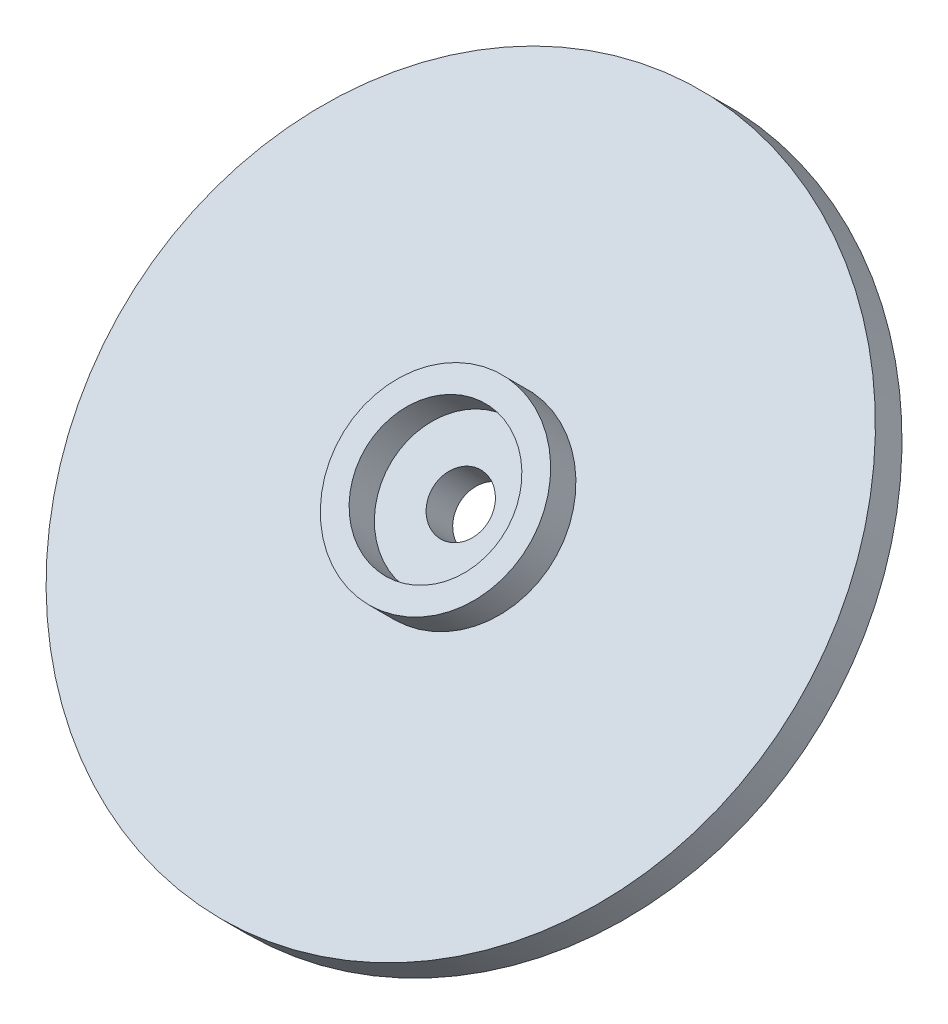
ISO-10303-21;
HEADER;
FILE_DESCRIPTION(('STEP AP214'),'2;1');
FILE_NAME('part.step','',(''),(''),'','','');
FILE_SCHEMA(('AUTOMOTIVE_DESIGN { 1 0 10303 214 1 1 1 1 }'));
ENDSEC;
DATA;
#1=APPLICATION_CONTEXT('core data for automotive mechanical design processes');
#2=APPLICATION_PROTOCOL_DEFINITION('international standard','automotive_design',2000,#1);
#3=PRODUCT_CONTEXT('',#1,'mechanical');
#4=PRODUCT('Part','Part','',(#3));
#5=PRODUCT_RELATED_PRODUCT_CATEGORY('part','',(#4));
#6=PRODUCT_DEFINITION_FORMATION('','',#4);
#7=PRODUCT_DEFINITION_CONTEXT('part definition',#1,'design');
#8=PRODUCT_DEFINITION('design','',#6,#7);
#9=PRODUCT_DEFINITION_SHAPE('','',#8);
#10=(LENGTH_UNIT() NAMED_UNIT(*) SI_UNIT(.MILLI.,.METRE.));
#11=(NAMED_UNIT(*) PLANE_ANGLE_UNIT() SI_UNIT($,.RADIAN.));
#12=(NAMED_UNIT(*) SI_UNIT($,.STERADIAN.) SOLID_ANGLE_UNIT());
#13=UNCERTAINTY_MEASURE_WITH_UNIT(LENGTH_MEASURE(1.E-05),#10,'distance_accuracy_value','');
#14=(GEOMETRIC_REPRESENTATION_CONTEXT(3) GLOBAL_UNCERTAINTY_ASSIGNED_CONTEXT((#13)) GLOBAL_UNIT_ASSIGNED_CONTEXT((#10,
#11,#12)) REPRESENTATION_CONTEXT('',''));
#15=CARTESIAN_POINT('',(0.,0.,0.));
#16=DIRECTION('',(0.,0.,1.));
#17=DIRECTION('',(1.,0.,0.));
#18=AXIS2_PLACEMENT_3D('',#15,#16,#17);
#19=CARTESIAN_POINT('',(0.,164.186081269666,-90.3723599574911));
#20=DIRECTION('',(0.,0.707106781186546,0.707106781186549));
#21=DIRECTION('',(0.,-0.707106781186549,0.707106781186546));
#22=AXIS2_PLACEMENT_3D('',#19,#20,#21);
#23=PLANE('',#22);
#24=CARTESIAN_POINT('',(0.,164.186081269666,-90.3723599574911));
#25=DIRECTION('',(0.,0.707106781186546,0.707106781186549));
#26=DIRECTION('',(0.,-0.707106781186549,0.707106781186546));
#27=AXIS2_PLACEMENT_3D('',#24,#25,#26);
#28=CIRCLE('',#27,50.);
#29=CARTESIAN_POINT('',(0.,128.830742210339,-55.0170208981637));
#30=VERTEX_POINT('',#29);
#31=EDGE_CURVE('E11',#30,#30,#28,.T.);
#32=ORIENTED_EDGE('',*,*,#31,.T.);
#33=EDGE_LOOP('',(#32));
#34=FACE_BOUND('',#33,.T.);
#35=CARTESIAN_POINT('',(0.,164.186081269666,-90.3723599574911));
#36=DIRECTION('',(0.,0.707106781186546,0.707106781186549));
#37=DIRECTION('',(0.,-0.707106781186549,0.707106781186546));
#38=AXIS2_PLACEMENT_3D('',#35,#36,#37);
#39=CIRCLE('',#38,37.5);
#40=CARTESIAN_POINT('',(0.,137.66957697517,-63.8558556629956));
#41=VERTEX_POINT('',#40);
#42=EDGE_CURVE('E54',#41,#41,#39,.T.);
#43=ORIENTED_EDGE('',*,*,#42,.F.);
#44=EDGE_LOOP('',(#43));
#45=FACE_BOUND('',#44,.T.);
#46=ADVANCED_FACE('F43',(#34,#45),#23,.T.);
#47=CARTESIAN_POINT('',(0.,150.751052427122,-103.807388800035));
#48=DIRECTION('',(0.,0.707106781186546,0.707106781186549));
#49=DIRECTION('',(0.,-0.707106781186549,0.707106781186546));
#50=AXIS2_PLACEMENT_3D('',#47,#48,#49);
#51=PLANE('',#50);
#52=CARTESIAN_POINT('',(0.,150.751052427122,-103.807388800035));
#53=DIRECTION('',(0.,0.707106781186546,0.707106781186549));
#54=DIRECTION('',(0.,-0.707106781186549,0.707106781186546));
#55=AXIS2_PLACEMENT_3D('',#52,#53,#54);
#56=CIRCLE('',#55,50.);
#57=CARTESIAN_POINT('',(0.,115.395713367794,-68.4520497407081));
#58=VERTEX_POINT('',#57);
#59=EDGE_CURVE('E47',#58,#58,#56,.T.);
#60=ORIENTED_EDGE('',*,*,#59,.F.);
#61=EDGE_LOOP('',(#60));
#62=FACE_BOUND('',#61,.T.);
#63=CARTESIAN_POINT('',(0.,150.751052427122,-103.807388800035));
#64=DIRECTION('',(0.,0.707106781186546,0.707106781186549));
#65=DIRECTION('',(0.,-0.707106781186549,0.707106781186546));
#66=AXIS2_PLACEMENT_3D('',#63,#64,#65);
#67=CIRCLE('',#66,37.5);
#68=CARTESIAN_POINT('',(0.,124.234548132626,-77.29088450554));
#69=VERTEX_POINT('',#68);
#70=EDGE_CURVE('E56',#69,#69,#67,.T.);
#71=ORIENTED_EDGE('',*,*,#70,.T.);
#72=EDGE_LOOP('',(#71));
#73=FACE_BOUND('',#72,.T.);
#74=ADVANCED_FACE('F66',(#62,#73),#51,.F.);
#75=CARTESIAN_POINT('',(0.,164.186081269666,-90.3723599574911));
#76=DIRECTION('',(0.,-0.707106781186547,-0.707106781186549));
#77=DIRECTION('',(0.,0.707106781186549,-0.707106781186546));
#78=AXIS2_PLACEMENT_3D('',#75,#76,#77);
#79=CYLINDRICAL_SURFACE('',#78,50.);
#80=ORIENTED_EDGE('',*,*,#31,.F.);
#81=EDGE_LOOP('',(#80));
#82=FACE_BOUND('',#81,.T.);
#83=ORIENTED_EDGE('',*,*,#59,.T.);
#84=EDGE_LOOP('',(#83));
#85=FACE_BOUND('',#84,.T.);
#86=ADVANCED_FACE('F45',(#82,#85),#79,.T.);
#87=CARTESIAN_POINT('',(0.,164.186081269666,-90.3723599574911));
#88=DIRECTION('',(0.,-0.707106781186547,-0.707106781186549));
#89=DIRECTION('',(0.,0.707106781186549,-0.707106781186546));
#90=AXIS2_PLACEMENT_3D('',#87,#88,#89);
#91=CYLINDRICAL_SURFACE('',#90,37.5);
#92=ORIENTED_EDGE('',*,*,#42,.T.);
#93=EDGE_LOOP('',(#92));
#94=FACE_BOUND('',#93,.T.);
#95=ORIENTED_EDGE('',*,*,#70,.F.);
#96=EDGE_LOOP('',(#95));
#97=FACE_BOUND('',#96,.T.);
#98=ADVANCED_FACE('F62',(#94,#97),#91,.F.);
#99=CLOSED_SHELL('',(#46,#74,#86,#98));
#100=MANIFOLD_SOLID_BREP('B2',#99);
#101=CARTESIAN_POINT('',(0.,150.751052427122,-103.807388800035));
#102=DIRECTION('',(0.,0.707106781186546,0.707106781186549));
#103=DIRECTION('',(0.,-0.707106781186549,0.707106781186546));
#104=AXIS2_PLACEMENT_3D('',#101,#102,#103);
#105=PLANE('',#104);
#106=CARTESIAN_POINT('',(0.,150.751052427122,-103.807388800035));
#107=DIRECTION('',(0.,0.707106781186546,0.707106781186549));
#108=DIRECTION('',(0.,-0.707106781186549,0.707106781186546));
#109=AXIS2_PLACEMENT_3D('',#106,#107,#108);
#110=CIRCLE('',#109,180.);
#111=CARTESIAN_POINT('',(0.,23.4718318135427,23.471831813543));
#112=VERTEX_POINT('',#111);
#113=EDGE_CURVE('E42',#112,#112,#110,.T.);
#114=ORIENTED_EDGE('',*,*,#113,.T.);
#115=EDGE_LOOP('',(#114));
#116=FACE_BOUND('',#115,.T.);
#117=CARTESIAN_POINT('',(0.,150.751052427122,-103.807388800035));
#118=DIRECTION('',(0.,0.707106781186546,0.707106781186549));
#119=DIRECTION('',(0.,-0.707106781186549,0.707106781186546));
#120=AXIS2_PLACEMENT_3D('',#117,#118,#119);
#121=CIRCLE('',#120,15.05);
#122=CARTESIAN_POINT('',(0.,140.109095370264,-93.1654317431779));
#123=VERTEX_POINT('',#122);
#124=EDGE_CURVE('E118',#123,#123,#121,.T.);
#125=ORIENTED_EDGE('',*,*,#124,.F.);
#126=EDGE_LOOP('',(#125));
#127=FACE_BOUND('',#126,.T.);
#128=ADVANCED_FACE('F107',(#116,#127),#105,.T.);
#129=CARTESIAN_POINT('',(0.,136.608916803391,-117.949524423766));
#130=DIRECTION('',(0.,0.707106781186546,0.707106781186549));
#131=DIRECTION('',(0.,-0.707106781186549,0.707106781186546));
#132=AXIS2_PLACEMENT_3D('',#129,#130,#131);
#133=PLANE('',#132);
#134=CARTESIAN_POINT('',(0.,136.608916803391,-117.949524423766));
#135=DIRECTION('',(0.,0.707106781186546,0.707106781186549));
#136=DIRECTION('',(0.,-0.707106781186549,0.707106781186546));
#137=AXIS2_PLACEMENT_3D('',#134,#135,#136);
#138=CIRCLE('',#137,180.);
#139=CARTESIAN_POINT('',(0.,9.32969618981175,9.32969618981205));
#140=VERTEX_POINT('',#139);
#141=EDGE_CURVE('E111',#140,#140,#138,.T.);
#142=ORIENTED_EDGE('',*,*,#141,.F.);
#143=EDGE_LOOP('',(#142));
#144=FACE_BOUND('',#143,.T.);
#145=CARTESIAN_POINT('',(0.,136.608916803391,-117.949524423766));
#146=DIRECTION('',(0.,0.707106781186546,0.707106781186549));
#147=DIRECTION('',(0.,-0.707106781186549,0.707106781186546));
#148=AXIS2_PLACEMENT_3D('',#145,#146,#147);
#149=CIRCLE('',#148,15.05);
#150=CARTESIAN_POINT('',(0.,125.966959746533,-107.307567366909));
#151=VERTEX_POINT('',#150);
#152=EDGE_CURVE('E120',#151,#151,#149,.T.);
#153=ORIENTED_EDGE('',*,*,#152,.T.);
#154=EDGE_LOOP('',(#153));
#155=FACE_BOUND('',#154,.T.);
#156=ADVANCED_FACE('F130',(#144,#155),#133,.F.);
#157=CARTESIAN_POINT('',(0.,150.751052427122,-103.807388800035));
#158=DIRECTION('',(0.,-0.707106781186546,-0.707106781186549));
#159=DIRECTION('',(0.,0.707106781186549,-0.707106781186546));
#160=AXIS2_PLACEMENT_3D('',#157,#158,#159);
#161=CYLINDRICAL_SURFACE('',#160,180.);
#162=ORIENTED_EDGE('',*,*,#113,.F.);
#163=EDGE_LOOP('',(#162));
#164=FACE_BOUND('',#163,.T.);
#165=ORIENTED_EDGE('',*,*,#141,.T.);
#166=EDGE_LOOP('',(#165));
#167=FACE_BOUND('',#166,.T.);
#168=ADVANCED_FACE('F109',(#164,#167),#161,.T.);
#169=CARTESIAN_POINT('',(0.,150.751052427122,-103.807388800035));
#170=DIRECTION('',(0.,-0.707106781186546,-0.707106781186549));
#171=DIRECTION('',(0.,0.707106781186549,-0.707106781186546));
#172=AXIS2_PLACEMENT_3D('',#169,#170,#171);
#173=CYLINDRICAL_SURFACE('',#172,15.05);
#174=ORIENTED_EDGE('',*,*,#124,.T.);
#175=EDGE_LOOP('',(#174));
#176=FACE_BOUND('',#175,.T.);
#177=ORIENTED_EDGE('',*,*,#152,.F.);
#178=EDGE_LOOP('',(#177));
#179=FACE_BOUND('',#178,.T.);
#180=ADVANCED_FACE('F126',(#176,#179),#173,.F.);
#181=CLOSED_SHELL('',(#128,#156,#168,#180));
#182=MANIFOLD_SOLID_BREP('B6',#181);
#183=ADVANCED_BREP_SHAPE_REPRESENTATION('',(#18,#100,#182),#14);
#184=SHAPE_DEFINITION_REPRESENTATION(#9,#183);
ENDSEC;
END-ISO-10303-21;
